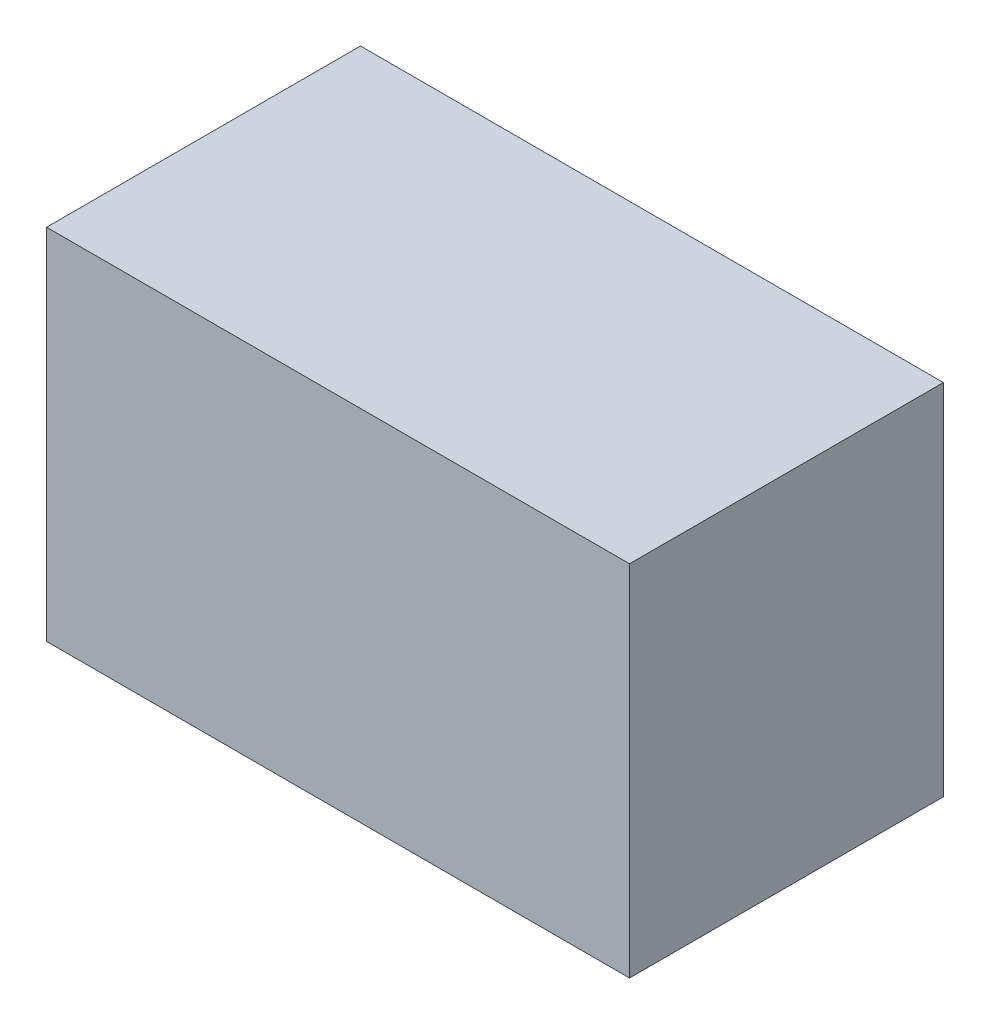
ISO-10303-21;
HEADER;
FILE_DESCRIPTION(('STEP AP214'),'2;1');
FILE_NAME('part.step','',(''),(''),'','','');
FILE_SCHEMA(('AUTOMOTIVE_DESIGN { 1 0 10303 214 1 1 1 1 }'));
ENDSEC;
DATA;
#1=APPLICATION_CONTEXT('core data for automotive mechanical design processes');
#2=APPLICATION_PROTOCOL_DEFINITION('international standard','automotive_design',2000,#1);
#3=PRODUCT_CONTEXT('',#1,'mechanical');
#4=PRODUCT('Part','Part','',(#3));
#5=PRODUCT_RELATED_PRODUCT_CATEGORY('part','',(#4));
#6=PRODUCT_DEFINITION_FORMATION('','',#4);
#7=PRODUCT_DEFINITION_CONTEXT('part definition',#1,'design');
#8=PRODUCT_DEFINITION('design','',#6,#7);
#9=PRODUCT_DEFINITION_SHAPE('','',#8);
#10=(LENGTH_UNIT() NAMED_UNIT(*) SI_UNIT(.MILLI.,.METRE.));
#11=(NAMED_UNIT(*) PLANE_ANGLE_UNIT() SI_UNIT($,.RADIAN.));
#12=(NAMED_UNIT(*) SI_UNIT($,.STERADIAN.) SOLID_ANGLE_UNIT());
#13=UNCERTAINTY_MEASURE_WITH_UNIT(LENGTH_MEASURE(1.E-05),#10,'distance_accuracy_value','');
#14=(GEOMETRIC_REPRESENTATION_CONTEXT(3) GLOBAL_UNCERTAINTY_ASSIGNED_CONTEXT((#13)) GLOBAL_UNIT_ASSIGNED_CONTEXT((#10,
#11,#12)) REPRESENTATION_CONTEXT('',''));
#15=CARTESIAN_POINT('',(0.,0.,0.));
#16=DIRECTION('',(0.,0.,1.));
#17=DIRECTION('',(1.,0.,0.));
#18=AXIS2_PLACEMENT_3D('',#15,#16,#17);
#19=CARTESIAN_POINT('',(32.5,37.10911804,35.));
#20=DIRECTION('',(-1.,0.,0.));
#21=DIRECTION('',(0.,0.,1.));
#22=AXIS2_PLACEMENT_3D('',#19,#20,#21);
#23=PLANE('',#22);
#24=DIRECTION('',(0.,1.,0.));
#25=VECTOR('',#24,1.);
#26=CARTESIAN_POINT('',(32.5,37.10911804,0.));
#27=LINE('',#26,#25);
#28=CARTESIAN_POINT('',(32.5,37.10911804,0.));
#29=VERTEX_POINT('',#28);
#30=CARTESIAN_POINT('',(32.5,77.10911804,0.));
#31=VERTEX_POINT('',#30);
#32=EDGE_CURVE('E102',#29,#31,#27,.T.);
#33=ORIENTED_EDGE('',*,*,#32,.T.);
#34=DIRECTION('',(0.,0.,-1.));
#35=VECTOR('',#34,1.);
#36=CARTESIAN_POINT('',(32.5,77.10911804,35.));
#37=LINE('',#36,#35);
#38=CARTESIAN_POINT('',(32.5,77.10911804,35.));
#39=VERTEX_POINT('',#38);
#40=EDGE_CURVE('E11',#39,#31,#37,.T.);
#41=ORIENTED_EDGE('',*,*,#40,.F.);
#42=DIRECTION('',(0.,1.,0.));
#43=VECTOR('',#42,1.);
#44=CARTESIAN_POINT('',(32.5,37.10911804,35.));
#45=LINE('',#44,#43);
#46=CARTESIAN_POINT('',(32.5,37.10911804,35.));
#47=VERTEX_POINT('',#46);
#48=EDGE_CURVE('E90',#47,#39,#45,.T.);
#49=ORIENTED_EDGE('',*,*,#48,.F.);
#50=DIRECTION('',(0.,0.,-1.));
#51=VECTOR('',#50,1.);
#52=CARTESIAN_POINT('',(32.5,37.10911804,35.));
#53=LINE('',#52,#51);
#54=EDGE_CURVE('E98',#47,#29,#53,.T.);
#55=ORIENTED_EDGE('',*,*,#54,.T.);
#56=EDGE_LOOP('',(#33,#41,#49,#55));
#57=FACE_BOUND('',#56,.T.);
#58=ADVANCED_FACE('F39',(#57),#23,.F.);
#59=CARTESIAN_POINT('',(-32.5,77.10911804,35.));
#60=DIRECTION('',(0.,-1.,0.));
#61=DIRECTION('',(0.,0.,-1.));
#62=AXIS2_PLACEMENT_3D('',#59,#60,#61);
#63=PLANE('',#62);
#64=DIRECTION('',(-1.,0.,0.));
#65=VECTOR('',#64,1.);
#66=CARTESIAN_POINT('',(-32.5,77.10911804,0.));
#67=LINE('',#66,#65);
#68=CARTESIAN_POINT('',(-32.5,77.10911804,0.));
#69=VERTEX_POINT('',#68);
#70=EDGE_CURVE('E94',#31,#69,#67,.T.);
#71=ORIENTED_EDGE('',*,*,#70,.T.);
#72=DIRECTION('',(0.,0.,-1.));
#73=VECTOR('',#72,1.);
#74=CARTESIAN_POINT('',(-32.5,77.10911804,35.));
#75=LINE('',#74,#73);
#76=CARTESIAN_POINT('',(-32.5,77.10911804,35.));
#77=VERTEX_POINT('',#76);
#78=EDGE_CURVE('E47',#77,#69,#75,.T.);
#79=ORIENTED_EDGE('',*,*,#78,.F.);
#80=DIRECTION('',(-1.,0.,0.));
#81=VECTOR('',#80,1.);
#82=CARTESIAN_POINT('',(-32.5,77.10911804,35.));
#83=LINE('',#82,#81);
#84=EDGE_CURVE('E85',#39,#77,#83,.T.);
#85=ORIENTED_EDGE('',*,*,#84,.F.);
#86=ORIENTED_EDGE('',*,*,#40,.T.);
#87=EDGE_LOOP('',(#71,#79,#85,#86));
#88=FACE_BOUND('',#87,.T.);
#89=ADVANCED_FACE('F93',(#88),#63,.F.);
#90=CARTESIAN_POINT('',(-32.5,37.10911804,35.));
#91=DIRECTION('',(1.,0.,0.));
#92=DIRECTION('',(0.,0.,-1.));
#93=AXIS2_PLACEMENT_3D('',#90,#91,#92);
#94=PLANE('',#93);
#95=DIRECTION('',(0.,-1.,0.));
#96=VECTOR('',#95,1.);
#97=CARTESIAN_POINT('',(-32.5,37.10911804,0.));
#98=LINE('',#97,#96);
#99=CARTESIAN_POINT('',(-32.5,37.10911804,0.));
#100=VERTEX_POINT('',#99);
#101=EDGE_CURVE('E72',#69,#100,#98,.T.);
#102=ORIENTED_EDGE('',*,*,#101,.T.);
#103=DIRECTION('',(0.,0.,-1.));
#104=VECTOR('',#103,1.);
#105=CARTESIAN_POINT('',(-32.5,37.10911804,35.));
#106=LINE('',#105,#104);
#107=CARTESIAN_POINT('',(-32.5,37.10911804,35.));
#108=VERTEX_POINT('',#107);
#109=EDGE_CURVE('E95',#108,#100,#106,.T.);
#110=ORIENTED_EDGE('',*,*,#109,.F.);
#111=DIRECTION('',(0.,-1.,0.));
#112=VECTOR('',#111,1.);
#113=CARTESIAN_POINT('',(-32.5,37.10911804,35.));
#114=LINE('',#113,#112);
#115=EDGE_CURVE('E88',#77,#108,#114,.T.);
#116=ORIENTED_EDGE('',*,*,#115,.F.);
#117=ORIENTED_EDGE('',*,*,#78,.T.);
#118=EDGE_LOOP('',(#102,#110,#116,#117));
#119=FACE_BOUND('',#118,.T.);
#120=ADVANCED_FACE('F96',(#119),#94,.F.);
#121=CARTESIAN_POINT('',(-32.5,37.10911804,35.));
#122=DIRECTION('',(0.,1.,0.));
#123=DIRECTION('',(0.,0.,1.));
#124=AXIS2_PLACEMENT_3D('',#121,#122,#123);
#125=PLANE('',#124);
#126=DIRECTION('',(1.,0.,0.));
#127=VECTOR('',#126,1.);
#128=CARTESIAN_POINT('',(-32.5,37.10911804,0.));
#129=LINE('',#128,#127);
#130=EDGE_CURVE('E78',#100,#29,#129,.T.);
#131=ORIENTED_EDGE('',*,*,#130,.T.);
#132=ORIENTED_EDGE('',*,*,#54,.F.);
#133=DIRECTION('',(1.,0.,0.));
#134=VECTOR('',#133,1.);
#135=CARTESIAN_POINT('',(-32.5,37.10911804,35.));
#136=LINE('',#135,#134);
#137=EDGE_CURVE('E55',#108,#47,#136,.T.);
#138=ORIENTED_EDGE('',*,*,#137,.F.);
#139=ORIENTED_EDGE('',*,*,#109,.T.);
#140=EDGE_LOOP('',(#131,#132,#138,#139));
#141=FACE_BOUND('',#140,.T.);
#142=ADVANCED_FACE('F109',(#141),#125,.F.);
#143=CARTESIAN_POINT('',(0.,0.,35.));
#144=DIRECTION('',(0.,0.,-1.));
#145=DIRECTION('',(-1.,0.,0.));
#146=AXIS2_PLACEMENT_3D('',#143,#144,#145);
#147=PLANE('',#146);
#148=ORIENTED_EDGE('',*,*,#48,.T.);
#149=ORIENTED_EDGE('',*,*,#84,.T.);
#150=ORIENTED_EDGE('',*,*,#115,.T.);
#151=ORIENTED_EDGE('',*,*,#137,.T.);
#152=EDGE_LOOP('',(#148,#149,#150,#151));
#153=FACE_BOUND('',#152,.T.);
#154=ADVANCED_FACE('F86',(#153),#147,.F.);
#155=CARTESIAN_POINT('',(0.,0.,0.));
#156=DIRECTION('',(0.,0.,-1.));
#157=DIRECTION('',(-1.,0.,0.));
#158=AXIS2_PLACEMENT_3D('',#155,#156,#157);
#159=PLANE('',#158);
#160=ORIENTED_EDGE('',*,*,#32,.F.);
#161=ORIENTED_EDGE('',*,*,#130,.F.);
#162=ORIENTED_EDGE('',*,*,#101,.F.);
#163=ORIENTED_EDGE('',*,*,#70,.F.);
#164=EDGE_LOOP('',(#160,#161,#162,#163));
#165=FACE_BOUND('',#164,.T.);
#166=ADVANCED_FACE('F112',(#165),#159,.T.);
#167=CLOSED_SHELL('',(#58,#89,#120,#142,#154,#166));
#168=MANIFOLD_SOLID_BREP('B2',#167);
#169=ADVANCED_BREP_SHAPE_REPRESENTATION('',(#18,#168),#14);
#170=SHAPE_DEFINITION_REPRESENTATION(#9,#169);
ENDSEC;
END-ISO-10303-21;
